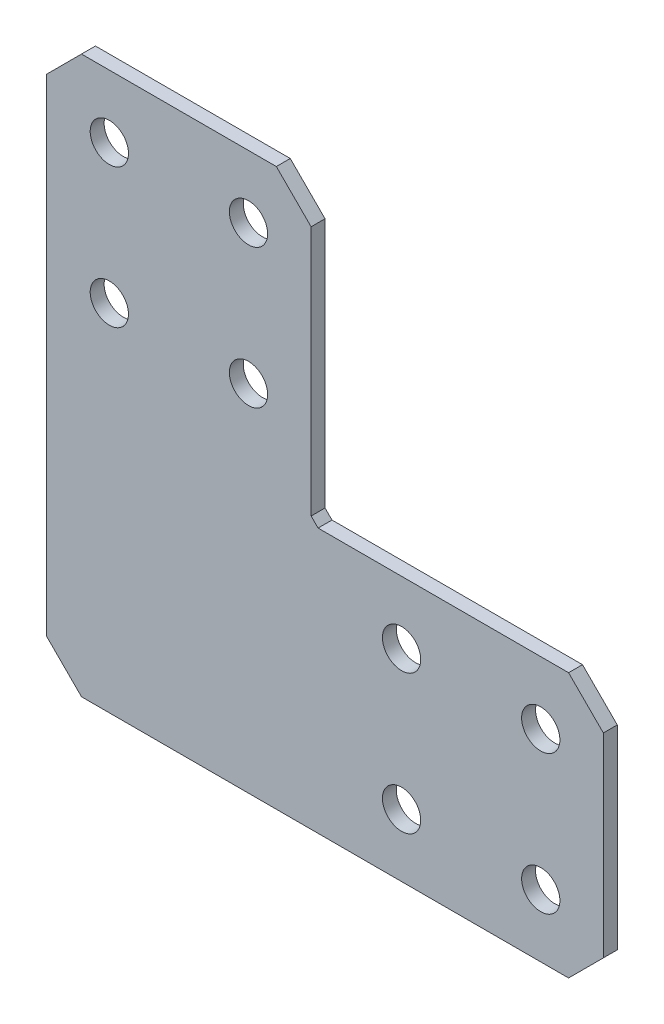
ISO-10303-21;
HEADER;
FILE_DESCRIPTION(('STEP AP214'),'2;1');
FILE_NAME('part.step','',(''),(''),'','','');
FILE_SCHEMA(('AUTOMOTIVE_DESIGN { 1 0 10303 214 1 1 1 1 }'));
ENDSEC;
DATA;
#1=APPLICATION_CONTEXT('core data for automotive mechanical design processes');
#2=APPLICATION_PROTOCOL_DEFINITION('international standard','automotive_design',2000,#1);
#3=PRODUCT_CONTEXT('',#1,'mechanical');
#4=PRODUCT('Part','Part','',(#3));
#5=PRODUCT_RELATED_PRODUCT_CATEGORY('part','',(#4));
#6=PRODUCT_DEFINITION_FORMATION('','',#4);
#7=PRODUCT_DEFINITION_CONTEXT('part definition',#1,'design');
#8=PRODUCT_DEFINITION('design','',#6,#7);
#9=PRODUCT_DEFINITION_SHAPE('','',#8);
#10=(LENGTH_UNIT() NAMED_UNIT(*) SI_UNIT(.MILLI.,.METRE.));
#11=(NAMED_UNIT(*) PLANE_ANGLE_UNIT() SI_UNIT($,.RADIAN.));
#12=(NAMED_UNIT(*) SI_UNIT($,.STERADIAN.) SOLID_ANGLE_UNIT());
#13=UNCERTAINTY_MEASURE_WITH_UNIT(LENGTH_MEASURE(1.E-05),#10,'distance_accuracy_value','');
#14=(GEOMETRIC_REPRESENTATION_CONTEXT(3) GLOBAL_UNCERTAINTY_ASSIGNED_CONTEXT((#13)) GLOBAL_UNIT_ASSIGNED_CONTEXT((#10,
#11,#12)) REPRESENTATION_CONTEXT('',''));
#15=CARTESIAN_POINT('',(0.,0.,0.));
#16=DIRECTION('',(0.,0.,1.));
#17=DIRECTION('',(1.,0.,0.));
#18=AXIS2_PLACEMENT_3D('',#15,#16,#17);
#19=CARTESIAN_POINT('',(0.,0.,2.));
#20=DIRECTION('',(0.,0.,1.));
#21=DIRECTION('',(1.,0.,0.));
#22=AXIS2_PLACEMENT_3D('',#19,#20,#21);
#23=PLANE('',#22);
#24=CARTESIAN_POINT('',(71.,9.00000000000001,2.));
#25=DIRECTION('',(0.,0.,1.));
#26=DIRECTION('',(1.,0.,0.));
#27=AXIS2_PLACEMENT_3D('',#24,#25,#26);
#28=CIRCLE('',#27,2.75000000000001);
#29=CARTESIAN_POINT('',(73.75,9.00000000000001,2.));
#30=VERTEX_POINT('',#29);
#31=EDGE_CURVE('E366',#30,#30,#28,.T.);
#32=ORIENTED_EDGE('',*,*,#31,.F.);
#33=EDGE_LOOP('',(#32));
#34=FACE_BOUND('',#33,.T.);
#35=CARTESIAN_POINT('',(51.,29.,2.));
#36=DIRECTION('',(0.,0.,1.));
#37=DIRECTION('',(1.,0.,0.));
#38=AXIS2_PLACEMENT_3D('',#35,#36,#37);
#39=CIRCLE('',#38,2.75);
#40=CARTESIAN_POINT('',(53.75,29.,2.));
#41=VERTEX_POINT('',#40);
#42=EDGE_CURVE('E360',#41,#41,#39,.T.);
#43=ORIENTED_EDGE('',*,*,#42,.F.);
#44=EDGE_LOOP('',(#43));
#45=FACE_BOUND('',#44,.T.);
#46=CARTESIAN_POINT('',(29.,51.,2.));
#47=DIRECTION('',(0.,0.,1.));
#48=DIRECTION('',(1.,0.,0.));
#49=AXIS2_PLACEMENT_3D('',#46,#47,#48);
#50=CIRCLE('',#49,2.75);
#51=CARTESIAN_POINT('',(31.75,51.,2.));
#52=VERTEX_POINT('',#51);
#53=EDGE_CURVE('E187',#52,#52,#50,.T.);
#54=ORIENTED_EDGE('',*,*,#53,.F.);
#55=EDGE_LOOP('',(#54));
#56=FACE_BOUND('',#55,.T.);
#57=CARTESIAN_POINT('',(9.,71.,2.));
#58=DIRECTION('',(0.,0.,1.));
#59=DIRECTION('',(1.,0.,0.));
#60=AXIS2_PLACEMENT_3D('',#57,#58,#59);
#61=CIRCLE('',#60,2.75);
#62=CARTESIAN_POINT('',(11.75,71.,2.));
#63=VERTEX_POINT('',#62);
#64=EDGE_CURVE('E188',#63,#63,#61,.T.);
#65=ORIENTED_EDGE('',*,*,#64,.F.);
#66=EDGE_LOOP('',(#65));
#67=FACE_BOUND('',#66,.T.);
#68=DIRECTION('',(1.,0.,0.));
#69=VECTOR('',#68,1.);
#70=CARTESIAN_POINT('',(38.,0.,2.));
#71=LINE('',#70,#69);
#72=CARTESIAN_POINT('',(5.,0.,2.));
#73=VERTEX_POINT('',#72);
#74=CARTESIAN_POINT('',(75.,0.,2.));
#75=VERTEX_POINT('',#74);
#76=EDGE_CURVE('E53',#73,#75,#71,.T.);
#77=ORIENTED_EDGE('',*,*,#76,.T.);
#78=DIRECTION('',(0.707106781186548,0.707106781186547,0.));
#79=VECTOR('',#78,1.);
#80=CARTESIAN_POINT('',(75.,0.,2.));
#81=LINE('',#80,#79);
#82=CARTESIAN_POINT('',(80.,5.,2.));
#83=VERTEX_POINT('',#82);
#84=EDGE_CURVE('E109',#75,#83,#81,.T.);
#85=ORIENTED_EDGE('',*,*,#84,.T.);
#86=DIRECTION('',(0.,1.,0.));
#87=VECTOR('',#86,1.);
#88=CARTESIAN_POINT('',(80.,5.,2.));
#89=LINE('',#88,#87);
#90=CARTESIAN_POINT('',(80.,33.,2.));
#91=VERTEX_POINT('',#90);
#92=EDGE_CURVE('E208',#83,#91,#89,.T.);
#93=ORIENTED_EDGE('',*,*,#92,.T.);
#94=DIRECTION('',(-0.707106781186548,0.707106781186547,0.));
#95=VECTOR('',#94,1.);
#96=CARTESIAN_POINT('',(75.,38.,2.));
#97=LINE('',#96,#95);
#98=CARTESIAN_POINT('',(75.,38.,2.));
#99=VERTEX_POINT('',#98);
#100=EDGE_CURVE('E212',#91,#99,#97,.T.);
#101=ORIENTED_EDGE('',*,*,#100,.T.);
#102=DIRECTION('',(-1.,0.,0.));
#103=VECTOR('',#102,1.);
#104=CARTESIAN_POINT('',(39.,38.,2.));
#105=LINE('',#104,#103);
#106=CARTESIAN_POINT('',(39.,38.,2.));
#107=VERTEX_POINT('',#106);
#108=EDGE_CURVE('E220',#99,#107,#105,.T.);
#109=ORIENTED_EDGE('',*,*,#108,.T.);
#110=DIRECTION('',(-0.70710678118655,0.707106781186545,0.));
#111=VECTOR('',#110,1.);
#112=CARTESIAN_POINT('',(39.,38.,2.));
#113=LINE('',#112,#111);
#114=CARTESIAN_POINT('',(38.,39.,2.));
#115=VERTEX_POINT('',#114);
#116=EDGE_CURVE('E223',#107,#115,#113,.T.);
#117=ORIENTED_EDGE('',*,*,#116,.T.);
#118=DIRECTION('',(0.,1.,0.));
#119=VECTOR('',#118,1.);
#120=CARTESIAN_POINT('',(38.,39.,2.));
#121=LINE('',#120,#119);
#122=CARTESIAN_POINT('',(38.,75.,2.));
#123=VERTEX_POINT('',#122);
#124=EDGE_CURVE('E227',#115,#123,#121,.T.);
#125=ORIENTED_EDGE('',*,*,#124,.T.);
#126=DIRECTION('',(-0.707106781186547,0.707106781186548,0.));
#127=VECTOR('',#126,1.);
#128=CARTESIAN_POINT('',(33.,80.,2.));
#129=LINE('',#128,#127);
#130=CARTESIAN_POINT('',(33.,80.,2.));
#131=VERTEX_POINT('',#130);
#132=EDGE_CURVE('E231',#123,#131,#129,.T.);
#133=ORIENTED_EDGE('',*,*,#132,.T.);
#134=DIRECTION('',(-1.,0.,0.));
#135=VECTOR('',#134,1.);
#136=CARTESIAN_POINT('',(5.,80.,2.));
#137=LINE('',#136,#135);
#138=CARTESIAN_POINT('',(5.,80.,2.));
#139=VERTEX_POINT('',#138);
#140=EDGE_CURVE('E141',#131,#139,#137,.T.);
#141=ORIENTED_EDGE('',*,*,#140,.T.);
#142=DIRECTION('',(-0.707106781186547,-0.707106781186548,0.));
#143=VECTOR('',#142,1.);
#144=CARTESIAN_POINT('',(0.,75.,2.));
#145=LINE('',#144,#143);
#146=CARTESIAN_POINT('',(0.,75.,2.));
#147=VERTEX_POINT('',#146);
#148=EDGE_CURVE('E135',#139,#147,#145,.T.);
#149=ORIENTED_EDGE('',*,*,#148,.T.);
#150=DIRECTION('',(0.,-1.,0.));
#151=VECTOR('',#150,1.);
#152=CARTESIAN_POINT('',(0.,5.,2.));
#153=LINE('',#152,#151);
#154=CARTESIAN_POINT('',(0.,5.,2.));
#155=VERTEX_POINT('',#154);
#156=EDGE_CURVE('E139',#147,#155,#153,.T.);
#157=ORIENTED_EDGE('',*,*,#156,.T.);
#158=DIRECTION('',(0.707106781186548,-0.707106781186548,0.));
#159=VECTOR('',#158,1.);
#160=CARTESIAN_POINT('',(0.,5.,2.));
#161=LINE('',#160,#159);
#162=EDGE_CURVE('E157',#155,#73,#161,.T.);
#163=ORIENTED_EDGE('',*,*,#162,.T.);
#164=EDGE_LOOP('',(#77,#85,#93,#101,#109,#117,#125,#133,#141,#149,#157,#163));
#165=FACE_BOUND('',#164,.T.);
#166=CARTESIAN_POINT('',(29.,71.,2.));
#167=DIRECTION('',(0.,0.,1.));
#168=DIRECTION('',(1.,0.,0.));
#169=AXIS2_PLACEMENT_3D('',#166,#167,#168);
#170=CIRCLE('',#169,2.75000000000001);
#171=CARTESIAN_POINT('',(31.75,71.,2.));
#172=VERTEX_POINT('',#171);
#173=EDGE_CURVE('E175',#172,#172,#170,.T.);
#174=ORIENTED_EDGE('',*,*,#173,.F.);
#175=EDGE_LOOP('',(#174));
#176=FACE_BOUND('',#175,.T.);
#177=CARTESIAN_POINT('',(9.,51.,2.));
#178=DIRECTION('',(0.,0.,1.));
#179=DIRECTION('',(1.,0.,0.));
#180=AXIS2_PLACEMENT_3D('',#177,#178,#179);
#181=CIRCLE('',#180,2.75000000000001);
#182=CARTESIAN_POINT('',(11.75,51.,2.));
#183=VERTEX_POINT('',#182);
#184=EDGE_CURVE('E386',#183,#183,#181,.T.);
#185=ORIENTED_EDGE('',*,*,#184,.F.);
#186=EDGE_LOOP('',(#185));
#187=FACE_BOUND('',#186,.T.);
#188=CARTESIAN_POINT('',(71.,29.,2.));
#189=DIRECTION('',(0.,0.,1.));
#190=DIRECTION('',(1.,0.,0.));
#191=AXIS2_PLACEMENT_3D('',#188,#189,#190);
#192=CIRCLE('',#191,2.75000000000001);
#193=CARTESIAN_POINT('',(73.75,29.,2.));
#194=VERTEX_POINT('',#193);
#195=EDGE_CURVE('E373',#194,#194,#192,.T.);
#196=ORIENTED_EDGE('',*,*,#195,.F.);
#197=EDGE_LOOP('',(#196));
#198=FACE_BOUND('',#197,.T.);
#199=CARTESIAN_POINT('',(51.,9.,2.));
#200=DIRECTION('',(0.,0.,1.));
#201=DIRECTION('',(1.,0.,0.));
#202=AXIS2_PLACEMENT_3D('',#199,#200,#201);
#203=CIRCLE('',#202,2.75);
#204=CARTESIAN_POINT('',(53.75,9.,2.));
#205=VERTEX_POINT('',#204);
#206=EDGE_CURVE('E376',#205,#205,#203,.T.);
#207=ORIENTED_EDGE('',*,*,#206,.F.);
#208=EDGE_LOOP('',(#207));
#209=FACE_BOUND('',#208,.T.);
#210=ADVANCED_FACE('F36',(#34,#45,#56,#67,#165,#176,#187,#198,#209),#23,.T.);
#211=CARTESIAN_POINT('',(0.,0.,0.));
#212=DIRECTION('',(0.,0.,1.));
#213=DIRECTION('',(1.,0.,0.));
#214=AXIS2_PLACEMENT_3D('',#211,#212,#213);
#215=PLANE('',#214);
#216=CARTESIAN_POINT('',(71.,9.00000000000001,0.));
#217=DIRECTION('',(0.,0.,1.));
#218=DIRECTION('',(1.,0.,0.));
#219=AXIS2_PLACEMENT_3D('',#216,#217,#218);
#220=CIRCLE('',#219,2.75000000000001);
#221=CARTESIAN_POINT('',(73.75,9.00000000000001,0.));
#222=VERTEX_POINT('',#221);
#223=EDGE_CURVE('E369',#222,#222,#220,.T.);
#224=ORIENTED_EDGE('',*,*,#223,.T.);
#225=EDGE_LOOP('',(#224));
#226=FACE_BOUND('',#225,.T.);
#227=CARTESIAN_POINT('',(51.,29.,0.));
#228=DIRECTION('',(0.,0.,1.));
#229=DIRECTION('',(1.,0.,0.));
#230=AXIS2_PLACEMENT_3D('',#227,#228,#229);
#231=CIRCLE('',#230,2.75);
#232=CARTESIAN_POINT('',(53.75,29.,0.));
#233=VERTEX_POINT('',#232);
#234=EDGE_CURVE('E364',#233,#233,#231,.T.);
#235=ORIENTED_EDGE('',*,*,#234,.T.);
#236=EDGE_LOOP('',(#235));
#237=FACE_BOUND('',#236,.T.);
#238=CARTESIAN_POINT('',(29.,51.,0.));
#239=DIRECTION('',(0.,0.,1.));
#240=DIRECTION('',(1.,0.,0.));
#241=AXIS2_PLACEMENT_3D('',#238,#239,#240);
#242=CIRCLE('',#241,2.75);
#243=CARTESIAN_POINT('',(31.75,51.,0.));
#244=VERTEX_POINT('',#243);
#245=EDGE_CURVE('E183',#244,#244,#242,.T.);
#246=ORIENTED_EDGE('',*,*,#245,.T.);
#247=EDGE_LOOP('',(#246));
#248=FACE_BOUND('',#247,.T.);
#249=CARTESIAN_POINT('',(9.,71.,0.));
#250=DIRECTION('',(0.,0.,1.));
#251=DIRECTION('',(1.,0.,0.));
#252=AXIS2_PLACEMENT_3D('',#249,#250,#251);
#253=CIRCLE('',#252,2.75);
#254=CARTESIAN_POINT('',(11.75,71.,0.));
#255=VERTEX_POINT('',#254);
#256=EDGE_CURVE('E181',#255,#255,#253,.T.);
#257=ORIENTED_EDGE('',*,*,#256,.T.);
#258=EDGE_LOOP('',(#257));
#259=FACE_BOUND('',#258,.T.);
#260=DIRECTION('',(0.707106781186548,0.707106781186547,0.));
#261=VECTOR('',#260,1.);
#262=CARTESIAN_POINT('',(75.,0.,0.));
#263=LINE('',#262,#261);
#264=CARTESIAN_POINT('',(75.,0.,0.));
#265=VERTEX_POINT('',#264);
#266=CARTESIAN_POINT('',(80.,5.,0.));
#267=VERTEX_POINT('',#266);
#268=EDGE_CURVE('E193',#265,#267,#263,.T.);
#269=ORIENTED_EDGE('',*,*,#268,.F.);
#270=DIRECTION('',(1.,0.,0.));
#271=VECTOR('',#270,1.);
#272=CARTESIAN_POINT('',(5.,0.,0.));
#273=LINE('',#272,#271);
#274=CARTESIAN_POINT('',(5.,0.,0.));
#275=VERTEX_POINT('',#274);
#276=EDGE_CURVE('E204',#275,#265,#273,.T.);
#277=ORIENTED_EDGE('',*,*,#276,.F.);
#278=DIRECTION('',(0.707106781186548,-0.707106781186548,0.));
#279=VECTOR('',#278,1.);
#280=CARTESIAN_POINT('',(0.,5.,0.));
#281=LINE('',#280,#279);
#282=CARTESIAN_POINT('',(0.,5.,0.));
#283=VERTEX_POINT('',#282);
#284=EDGE_CURVE('E102',#283,#275,#281,.T.);
#285=ORIENTED_EDGE('',*,*,#284,.F.);
#286=DIRECTION('',(0.,-1.,0.));
#287=VECTOR('',#286,1.);
#288=CARTESIAN_POINT('',(0.,5.,0.));
#289=LINE('',#288,#287);
#290=CARTESIAN_POINT('',(0.,75.,0.));
#291=VERTEX_POINT('',#290);
#292=EDGE_CURVE('E95',#291,#283,#289,.T.);
#293=ORIENTED_EDGE('',*,*,#292,.F.);
#294=DIRECTION('',(-0.707106781186547,-0.707106781186548,0.));
#295=VECTOR('',#294,1.);
#296=CARTESIAN_POINT('',(0.,75.,0.));
#297=LINE('',#296,#295);
#298=CARTESIAN_POINT('',(5.,80.,0.));
#299=VERTEX_POINT('',#298);
#300=EDGE_CURVE('E150',#299,#291,#297,.T.);
#301=ORIENTED_EDGE('',*,*,#300,.F.);
#302=DIRECTION('',(-1.,0.,0.));
#303=VECTOR('',#302,1.);
#304=CARTESIAN_POINT('',(5.,80.,0.));
#305=LINE('',#304,#303);
#306=CARTESIAN_POINT('',(33.,80.,0.));
#307=VERTEX_POINT('',#306);
#308=EDGE_CURVE('E253',#307,#299,#305,.T.);
#309=ORIENTED_EDGE('',*,*,#308,.F.);
#310=DIRECTION('',(-0.707106781186547,0.707106781186548,0.));
#311=VECTOR('',#310,1.);
#312=CARTESIAN_POINT('',(33.,80.,0.));
#313=LINE('',#312,#311);
#314=CARTESIAN_POINT('',(38.,75.,0.));
#315=VERTEX_POINT('',#314);
#316=EDGE_CURVE('E247',#315,#307,#313,.T.);
#317=ORIENTED_EDGE('',*,*,#316,.F.);
#318=DIRECTION('',(0.,1.,0.));
#319=VECTOR('',#318,1.);
#320=CARTESIAN_POINT('',(38.,39.,0.));
#321=LINE('',#320,#319);
#322=CARTESIAN_POINT('',(38.,39.,0.));
#323=VERTEX_POINT('',#322);
#324=EDGE_CURVE('E291',#323,#315,#321,.T.);
#325=ORIENTED_EDGE('',*,*,#324,.F.);
#326=DIRECTION('',(-0.70710678118655,0.707106781186545,0.));
#327=VECTOR('',#326,1.);
#328=CARTESIAN_POINT('',(39.,38.,0.));
#329=LINE('',#328,#327);
#330=CARTESIAN_POINT('',(39.,38.,0.));
#331=VERTEX_POINT('',#330);
#332=EDGE_CURVE('E289',#331,#323,#329,.T.);
#333=ORIENTED_EDGE('',*,*,#332,.F.);
#334=DIRECTION('',(-1.,0.,0.));
#335=VECTOR('',#334,1.);
#336=CARTESIAN_POINT('',(39.,38.,0.));
#337=LINE('',#336,#335);
#338=CARTESIAN_POINT('',(75.,38.,0.));
#339=VERTEX_POINT('',#338);
#340=EDGE_CURVE('E285',#339,#331,#337,.T.);
#341=ORIENTED_EDGE('',*,*,#340,.F.);
#342=DIRECTION('',(-0.707106781186548,0.707106781186547,0.));
#343=VECTOR('',#342,1.);
#344=CARTESIAN_POINT('',(75.,38.,0.));
#345=LINE('',#344,#343);
#346=CARTESIAN_POINT('',(80.,33.,0.));
#347=VERTEX_POINT('',#346);
#348=EDGE_CURVE('E283',#347,#339,#345,.T.);
#349=ORIENTED_EDGE('',*,*,#348,.F.);
#350=DIRECTION('',(0.,1.,0.));
#351=VECTOR('',#350,1.);
#352=CARTESIAN_POINT('',(80.,5.,0.));
#353=LINE('',#352,#351);
#354=EDGE_CURVE('E275',#267,#347,#353,.T.);
#355=ORIENTED_EDGE('',*,*,#354,.F.);
#356=EDGE_LOOP('',(#269,#277,#285,#293,#301,#309,#317,#325,#333,#341,#349,#355));
#357=FACE_BOUND('',#356,.T.);
#358=CARTESIAN_POINT('',(29.,71.,0.));
#359=DIRECTION('',(0.,0.,1.));
#360=DIRECTION('',(1.,0.,0.));
#361=AXIS2_PLACEMENT_3D('',#358,#359,#360);
#362=CIRCLE('',#361,2.75000000000001);
#363=CARTESIAN_POINT('',(31.75,71.,0.));
#364=VERTEX_POINT('',#363);
#365=EDGE_CURVE('E182',#364,#364,#362,.T.);
#366=ORIENTED_EDGE('',*,*,#365,.T.);
#367=EDGE_LOOP('',(#366));
#368=FACE_BOUND('',#367,.T.);
#369=CARTESIAN_POINT('',(9.,51.,0.));
#370=DIRECTION('',(0.,0.,1.));
#371=DIRECTION('',(1.,0.,0.));
#372=AXIS2_PLACEMENT_3D('',#369,#370,#371);
#373=CIRCLE('',#372,2.75000000000001);
#374=CARTESIAN_POINT('',(11.75,51.,0.));
#375=VERTEX_POINT('',#374);
#376=EDGE_CURVE('E363',#375,#375,#373,.T.);
#377=ORIENTED_EDGE('',*,*,#376,.T.);
#378=EDGE_LOOP('',(#377));
#379=FACE_BOUND('',#378,.T.);
#380=CARTESIAN_POINT('',(71.,29.,0.));
#381=DIRECTION('',(0.,0.,1.));
#382=DIRECTION('',(1.,0.,0.));
#383=AXIS2_PLACEMENT_3D('',#380,#381,#382);
#384=CIRCLE('',#383,2.75000000000001);
#385=CARTESIAN_POINT('',(73.75,29.,0.));
#386=VERTEX_POINT('',#385);
#387=EDGE_CURVE('E368',#386,#386,#384,.T.);
#388=ORIENTED_EDGE('',*,*,#387,.T.);
#389=EDGE_LOOP('',(#388));
#390=FACE_BOUND('',#389,.T.);
#391=CARTESIAN_POINT('',(51.,9.,0.));
#392=DIRECTION('',(0.,0.,1.));
#393=DIRECTION('',(1.,0.,0.));
#394=AXIS2_PLACEMENT_3D('',#391,#392,#393);
#395=CIRCLE('',#394,2.75);
#396=CARTESIAN_POINT('',(53.75,9.,0.));
#397=VERTEX_POINT('',#396);
#398=EDGE_CURVE('E380',#397,#397,#395,.T.);
#399=ORIENTED_EDGE('',*,*,#398,.T.);
#400=EDGE_LOOP('',(#399));
#401=FACE_BOUND('',#400,.T.);
#402=ADVANCED_FACE('F279',(#226,#237,#248,#259,#357,#368,#379,#390,#401),#215,.F.);
#403=CARTESIAN_POINT('',(75.,0.,2.));
#404=DIRECTION('',(-0.707106781186547,0.707106781186548,0.));
#405=DIRECTION('',(-0.707106781186548,-0.707106781186547,0.));
#406=AXIS2_PLACEMENT_3D('',#403,#404,#405);
#407=PLANE('',#406);
#408=ORIENTED_EDGE('',*,*,#268,.T.);
#409=DIRECTION('',(0.,0.,-1.));
#410=VECTOR('',#409,1.);
#411=CARTESIAN_POINT('',(80.,5.,2.));
#412=LINE('',#411,#410);
#413=EDGE_CURVE('E45',#83,#267,#412,.T.);
#414=ORIENTED_EDGE('',*,*,#413,.F.);
#415=ORIENTED_EDGE('',*,*,#84,.F.);
#416=DIRECTION('',(0.,0.,-1.));
#417=VECTOR('',#416,1.);
#418=CARTESIAN_POINT('',(75.,0.,2.));
#419=LINE('',#418,#417);
#420=EDGE_CURVE('E12',#75,#265,#419,.T.);
#421=ORIENTED_EDGE('',*,*,#420,.T.);
#422=EDGE_LOOP('',(#408,#414,#415,#421));
#423=FACE_BOUND('',#422,.T.);
#424=ADVANCED_FACE('F38',(#423),#407,.F.);
#425=CARTESIAN_POINT('',(80.,5.,2.));
#426=DIRECTION('',(-1.,0.,0.));
#427=DIRECTION('',(0.,0.,1.));
#428=AXIS2_PLACEMENT_3D('',#425,#426,#427);
#429=PLANE('',#428);
#430=ORIENTED_EDGE('',*,*,#354,.T.);
#431=DIRECTION('',(0.,0.,-1.));
#432=VECTOR('',#431,1.);
#433=CARTESIAN_POINT('',(80.,33.,2.));
#434=LINE('',#433,#432);
#435=EDGE_CURVE('E267',#91,#347,#434,.T.);
#436=ORIENTED_EDGE('',*,*,#435,.F.);
#437=ORIENTED_EDGE('',*,*,#92,.F.);
#438=ORIENTED_EDGE('',*,*,#413,.T.);
#439=EDGE_LOOP('',(#430,#436,#437,#438));
#440=FACE_BOUND('',#439,.T.);
#441=ADVANCED_FACE('F273',(#440),#429,.F.);
#442=CARTESIAN_POINT('',(75.,38.,2.));
#443=DIRECTION('',(-0.707106781186547,-0.707106781186548,0.));
#444=DIRECTION('',(0.707106781186548,-0.707106781186547,0.));
#445=AXIS2_PLACEMENT_3D('',#442,#443,#444);
#446=PLANE('',#445);
#447=ORIENTED_EDGE('',*,*,#348,.T.);
#448=DIRECTION('',(0.,0.,-1.));
#449=VECTOR('',#448,1.);
#450=CARTESIAN_POINT('',(75.,38.,2.));
#451=LINE('',#450,#449);
#452=EDGE_CURVE('E264',#99,#339,#451,.T.);
#453=ORIENTED_EDGE('',*,*,#452,.F.);
#454=ORIENTED_EDGE('',*,*,#100,.F.);
#455=ORIENTED_EDGE('',*,*,#435,.T.);
#456=EDGE_LOOP('',(#447,#453,#454,#455));
#457=FACE_BOUND('',#456,.T.);
#458=ADVANCED_FACE('F306',(#457),#446,.F.);
#459=CARTESIAN_POINT('',(39.,38.,2.));
#460=DIRECTION('',(0.,-1.,0.));
#461=DIRECTION('',(1.,0.,0.));
#462=AXIS2_PLACEMENT_3D('',#459,#460,#461);
#463=PLANE('',#462);
#464=ORIENTED_EDGE('',*,*,#340,.T.);
#465=DIRECTION('',(0.,0.,-1.));
#466=VECTOR('',#465,1.);
#467=CARTESIAN_POINT('',(39.,38.,2.));
#468=LINE('',#467,#466);
#469=EDGE_CURVE('E261',#107,#331,#468,.T.);
#470=ORIENTED_EDGE('',*,*,#469,.F.);
#471=ORIENTED_EDGE('',*,*,#108,.F.);
#472=ORIENTED_EDGE('',*,*,#452,.T.);
#473=EDGE_LOOP('',(#464,#470,#471,#472));
#474=FACE_BOUND('',#473,.T.);
#475=ADVANCED_FACE('F339',(#474),#463,.F.);
#476=CARTESIAN_POINT('',(39.,38.,2.));
#477=DIRECTION('',(-0.707106781186545,-0.70710678118655,0.));
#478=DIRECTION('',(0.70710678118655,-0.707106781186545,0.));
#479=AXIS2_PLACEMENT_3D('',#476,#477,#478);
#480=PLANE('',#479);
#481=ORIENTED_EDGE('',*,*,#332,.T.);
#482=DIRECTION('',(0.,0.,-1.));
#483=VECTOR('',#482,1.);
#484=CARTESIAN_POINT('',(38.,39.,2.));
#485=LINE('',#484,#483);
#486=EDGE_CURVE('E258',#115,#323,#485,.T.);
#487=ORIENTED_EDGE('',*,*,#486,.F.);
#488=ORIENTED_EDGE('',*,*,#116,.F.);
#489=ORIENTED_EDGE('',*,*,#469,.T.);
#490=EDGE_LOOP('',(#481,#487,#488,#489));
#491=FACE_BOUND('',#490,.T.);
#492=ADVANCED_FACE('F335',(#491),#480,.F.);
#493=CARTESIAN_POINT('',(38.,39.,2.));
#494=DIRECTION('',(-1.,0.,0.));
#495=DIRECTION('',(0.,0.,1.));
#496=AXIS2_PLACEMENT_3D('',#493,#494,#495);
#497=PLANE('',#496);
#498=ORIENTED_EDGE('',*,*,#324,.T.);
#499=DIRECTION('',(0.,0.,-1.));
#500=VECTOR('',#499,1.);
#501=CARTESIAN_POINT('',(38.,75.,2.));
#502=LINE('',#501,#500);
#503=EDGE_CURVE('E250',#123,#315,#502,.T.);
#504=ORIENTED_EDGE('',*,*,#503,.F.);
#505=ORIENTED_EDGE('',*,*,#124,.F.);
#506=ORIENTED_EDGE('',*,*,#486,.T.);
#507=EDGE_LOOP('',(#498,#504,#505,#506));
#508=FACE_BOUND('',#507,.T.);
#509=ADVANCED_FACE('F332',(#508),#497,.F.);
#510=CARTESIAN_POINT('',(33.,80.,2.));
#511=DIRECTION('',(-0.707106781186548,-0.707106781186547,0.));
#512=DIRECTION('',(0.707106781186547,-0.707106781186548,0.));
#513=AXIS2_PLACEMENT_3D('',#510,#511,#512);
#514=PLANE('',#513);
#515=ORIENTED_EDGE('',*,*,#316,.T.);
#516=DIRECTION('',(0.,0.,-1.));
#517=VECTOR('',#516,1.);
#518=CARTESIAN_POINT('',(33.,80.,2.));
#519=LINE('',#518,#517);
#520=EDGE_CURVE('E244',#131,#307,#519,.T.);
#521=ORIENTED_EDGE('',*,*,#520,.F.);
#522=ORIENTED_EDGE('',*,*,#132,.F.);
#523=ORIENTED_EDGE('',*,*,#503,.T.);
#524=EDGE_LOOP('',(#515,#521,#522,#523));
#525=FACE_BOUND('',#524,.T.);
#526=ADVANCED_FACE('F245',(#525),#514,.F.);
#527=CARTESIAN_POINT('',(5.,80.,2.));
#528=DIRECTION('',(0.,-1.,0.));
#529=DIRECTION('',(0.,0.,-1.));
#530=AXIS2_PLACEMENT_3D('',#527,#528,#529);
#531=PLANE('',#530);
#532=ORIENTED_EDGE('',*,*,#308,.T.);
#533=DIRECTION('',(0.,0.,-1.));
#534=VECTOR('',#533,1.);
#535=CARTESIAN_POINT('',(5.,80.,2.));
#536=LINE('',#535,#534);
#537=EDGE_CURVE('E151',#139,#299,#536,.T.);
#538=ORIENTED_EDGE('',*,*,#537,.F.);
#539=ORIENTED_EDGE('',*,*,#140,.F.);
#540=ORIENTED_EDGE('',*,*,#520,.T.);
#541=EDGE_LOOP('',(#532,#538,#539,#540));
#542=FACE_BOUND('',#541,.T.);
#543=ADVANCED_FACE('F252',(#542),#531,.F.);
#544=CARTESIAN_POINT('',(0.,75.,2.));
#545=DIRECTION('',(0.707106781186548,-0.707106781186547,0.));
#546=DIRECTION('',(0.707106781186547,0.707106781186548,0.));
#547=AXIS2_PLACEMENT_3D('',#544,#545,#546);
#548=PLANE('',#547);
#549=ORIENTED_EDGE('',*,*,#300,.T.);
#550=DIRECTION('',(0.,0.,-1.));
#551=VECTOR('',#550,1.);
#552=CARTESIAN_POINT('',(0.,75.,2.));
#553=LINE('',#552,#551);
#554=EDGE_CURVE('E147',#147,#291,#553,.T.);
#555=ORIENTED_EDGE('',*,*,#554,.F.);
#556=ORIENTED_EDGE('',*,*,#148,.F.);
#557=ORIENTED_EDGE('',*,*,#537,.T.);
#558=EDGE_LOOP('',(#549,#555,#556,#557));
#559=FACE_BOUND('',#558,.T.);
#560=ADVANCED_FACE('F148',(#559),#548,.F.);
#561=CARTESIAN_POINT('',(0.,5.,2.));
#562=DIRECTION('',(1.,0.,0.));
#563=DIRECTION('',(0.,0.,-1.));
#564=AXIS2_PLACEMENT_3D('',#561,#562,#563);
#565=PLANE('',#564);
#566=ORIENTED_EDGE('',*,*,#292,.T.);
#567=DIRECTION('',(0.,0.,-1.));
#568=VECTOR('',#567,1.);
#569=CARTESIAN_POINT('',(0.,5.,2.));
#570=LINE('',#569,#568);
#571=EDGE_CURVE('E152',#155,#283,#570,.T.);
#572=ORIENTED_EDGE('',*,*,#571,.F.);
#573=ORIENTED_EDGE('',*,*,#156,.F.);
#574=ORIENTED_EDGE('',*,*,#554,.T.);
#575=EDGE_LOOP('',(#566,#572,#573,#574));
#576=FACE_BOUND('',#575,.T.);
#577=ADVANCED_FACE('F154',(#576),#565,.F.);
#578=CARTESIAN_POINT('',(0.,5.,2.));
#579=DIRECTION('',(0.707106781186547,0.707106781186547,0.));
#580=DIRECTION('',(-0.707106781186548,0.707106781186548,0.));
#581=AXIS2_PLACEMENT_3D('',#578,#579,#580);
#582=PLANE('',#581);
#583=ORIENTED_EDGE('',*,*,#284,.T.);
#584=DIRECTION('',(0.,0.,-1.));
#585=VECTOR('',#584,1.);
#586=CARTESIAN_POINT('',(5.,0.,2.));
#587=LINE('',#586,#585);
#588=EDGE_CURVE('E160',#73,#275,#587,.T.);
#589=ORIENTED_EDGE('',*,*,#588,.F.);
#590=ORIENTED_EDGE('',*,*,#162,.F.);
#591=ORIENTED_EDGE('',*,*,#571,.T.);
#592=EDGE_LOOP('',(#583,#589,#590,#591));
#593=FACE_BOUND('',#592,.T.);
#594=ADVANCED_FACE('F299',(#593),#582,.F.);
#595=CARTESIAN_POINT('',(5.,0.,2.));
#596=DIRECTION('',(0.,1.,0.));
#597=DIRECTION('',(0.,0.,1.));
#598=AXIS2_PLACEMENT_3D('',#595,#596,#597);
#599=PLANE('',#598);
#600=ORIENTED_EDGE('',*,*,#276,.T.);
#601=ORIENTED_EDGE('',*,*,#420,.F.);
#602=ORIENTED_EDGE('',*,*,#76,.F.);
#603=ORIENTED_EDGE('',*,*,#588,.T.);
#604=EDGE_LOOP('',(#600,#601,#602,#603));
#605=FACE_BOUND('',#604,.T.);
#606=ADVANCED_FACE('F300',(#605),#599,.F.);
#607=CARTESIAN_POINT('',(9.,71.,2.));
#608=DIRECTION('',(0.,0.,-1.));
#609=DIRECTION('',(-1.,0.,0.));
#610=AXIS2_PLACEMENT_3D('',#607,#608,#609);
#611=CYLINDRICAL_SURFACE('',#610,2.75);
#612=ORIENTED_EDGE('',*,*,#64,.T.);
#613=EDGE_LOOP('',(#612));
#614=FACE_BOUND('',#613,.T.);
#615=ORIENTED_EDGE('',*,*,#256,.F.);
#616=EDGE_LOOP('',(#615));
#617=FACE_BOUND('',#616,.T.);
#618=ADVANCED_FACE('F317',(#614,#617),#611,.F.);
#619=CARTESIAN_POINT('',(29.,71.,2.));
#620=DIRECTION('',(0.,0.,-1.));
#621=DIRECTION('',(-1.,0.,0.));
#622=AXIS2_PLACEMENT_3D('',#619,#620,#621);
#623=CYLINDRICAL_SURFACE('',#622,2.75000000000001);
#624=ORIENTED_EDGE('',*,*,#173,.T.);
#625=EDGE_LOOP('',(#624));
#626=FACE_BOUND('',#625,.T.);
#627=ORIENTED_EDGE('',*,*,#365,.F.);
#628=EDGE_LOOP('',(#627));
#629=FACE_BOUND('',#628,.T.);
#630=ADVANCED_FACE('F410',(#626,#629),#623,.F.);
#631=CARTESIAN_POINT('',(29.,51.,2.));
#632=DIRECTION('',(0.,0.,-1.));
#633=DIRECTION('',(-1.,0.,0.));
#634=AXIS2_PLACEMENT_3D('',#631,#632,#633);
#635=CYLINDRICAL_SURFACE('',#634,2.75);
#636=ORIENTED_EDGE('',*,*,#53,.T.);
#637=EDGE_LOOP('',(#636));
#638=FACE_BOUND('',#637,.T.);
#639=ORIENTED_EDGE('',*,*,#245,.F.);
#640=EDGE_LOOP('',(#639));
#641=FACE_BOUND('',#640,.T.);
#642=ADVANCED_FACE('F400',(#638,#641),#635,.F.);
#643=CARTESIAN_POINT('',(9.,51.,2.));
#644=DIRECTION('',(0.,0.,-1.));
#645=DIRECTION('',(-1.,0.,0.));
#646=AXIS2_PLACEMENT_3D('',#643,#644,#645);
#647=CYLINDRICAL_SURFACE('',#646,2.75000000000001);
#648=ORIENTED_EDGE('',*,*,#184,.T.);
#649=EDGE_LOOP('',(#648));
#650=FACE_BOUND('',#649,.T.);
#651=ORIENTED_EDGE('',*,*,#376,.F.);
#652=EDGE_LOOP('',(#651));
#653=FACE_BOUND('',#652,.T.);
#654=ADVANCED_FACE('F397',(#650,#653),#647,.F.);
#655=CARTESIAN_POINT('',(51.,29.,2.));
#656=DIRECTION('',(0.,0.,-1.));
#657=DIRECTION('',(-1.,0.,0.));
#658=AXIS2_PLACEMENT_3D('',#655,#656,#657);
#659=CYLINDRICAL_SURFACE('',#658,2.75);
#660=ORIENTED_EDGE('',*,*,#42,.T.);
#661=EDGE_LOOP('',(#660));
#662=FACE_BOUND('',#661,.T.);
#663=ORIENTED_EDGE('',*,*,#234,.F.);
#664=EDGE_LOOP('',(#663));
#665=FACE_BOUND('',#664,.T.);
#666=ADVANCED_FACE('F399',(#662,#665),#659,.F.);
#667=CARTESIAN_POINT('',(71.,29.,2.));
#668=DIRECTION('',(0.,0.,-1.));
#669=DIRECTION('',(-1.,0.,0.));
#670=AXIS2_PLACEMENT_3D('',#667,#668,#669);
#671=CYLINDRICAL_SURFACE('',#670,2.75000000000001);
#672=ORIENTED_EDGE('',*,*,#195,.T.);
#673=EDGE_LOOP('',(#672));
#674=FACE_BOUND('',#673,.T.);
#675=ORIENTED_EDGE('',*,*,#387,.F.);
#676=EDGE_LOOP('',(#675));
#677=FACE_BOUND('',#676,.T.);
#678=ADVANCED_FACE('F407',(#674,#677),#671,.F.);
#679=CARTESIAN_POINT('',(71.,9.00000000000001,2.));
#680=DIRECTION('',(0.,0.,-1.));
#681=DIRECTION('',(-1.,0.,0.));
#682=AXIS2_PLACEMENT_3D('',#679,#680,#681);
#683=CYLINDRICAL_SURFACE('',#682,2.75000000000001);
#684=ORIENTED_EDGE('',*,*,#31,.T.);
#685=EDGE_LOOP('',(#684));
#686=FACE_BOUND('',#685,.T.);
#687=ORIENTED_EDGE('',*,*,#223,.F.);
#688=EDGE_LOOP('',(#687));
#689=FACE_BOUND('',#688,.T.);
#690=ADVANCED_FACE('F441',(#686,#689),#683,.F.);
#691=CARTESIAN_POINT('',(51.,9.,2.));
#692=DIRECTION('',(0.,0.,-1.));
#693=DIRECTION('',(-1.,0.,0.));
#694=AXIS2_PLACEMENT_3D('',#691,#692,#693);
#695=CYLINDRICAL_SURFACE('',#694,2.75);
#696=ORIENTED_EDGE('',*,*,#206,.T.);
#697=EDGE_LOOP('',(#696));
#698=FACE_BOUND('',#697,.T.);
#699=ORIENTED_EDGE('',*,*,#398,.F.);
#700=EDGE_LOOP('',(#699));
#701=FACE_BOUND('',#700,.T.);
#702=ADVANCED_FACE('F439',(#698,#701),#695,.F.);
#703=CLOSED_SHELL('',(#210,#402,#424,#441,#458,#475,#492,#509,#526,#543,#560,#577,#594,#606,
#618,#630,#642,#654,#666,#678,#690,#702));
#704=MANIFOLD_SOLID_BREP('B2',#703);
#705=ADVANCED_BREP_SHAPE_REPRESENTATION('',(#18,#704),#14);
#706=SHAPE_DEFINITION_REPRESENTATION(#9,#705);
ENDSEC;
END-ISO-10303-21;
